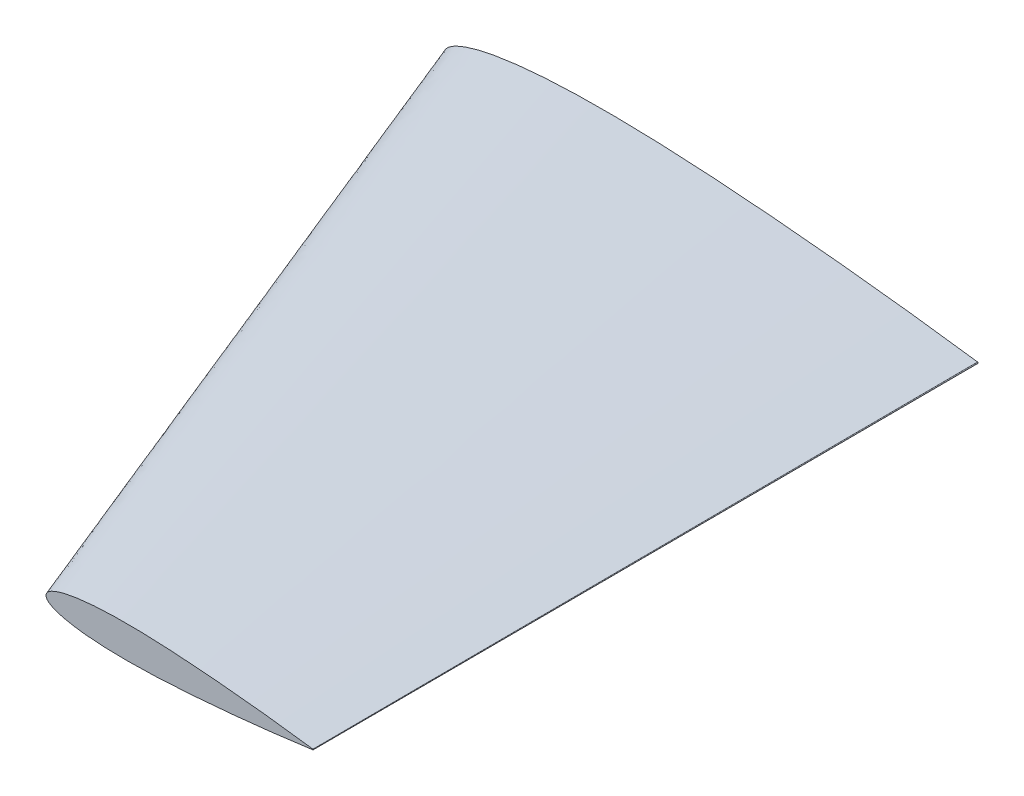
ISO-10303-21;
HEADER;
FILE_DESCRIPTION(('STEP AP214'),'2;1');
FILE_NAME('part.step','',(''),(''),'','','');
FILE_SCHEMA(('AUTOMOTIVE_DESIGN { 1 0 10303 214 1 1 1 1 }'));
ENDSEC;
DATA;
#1=APPLICATION_CONTEXT('core data for automotive mechanical design processes');
#2=APPLICATION_PROTOCOL_DEFINITION('international standard','automotive_design',2000,#1);
#3=PRODUCT_CONTEXT('',#1,'mechanical');
#4=PRODUCT('Part','Part','',(#3));
#5=PRODUCT_RELATED_PRODUCT_CATEGORY('part','',(#4));
#6=PRODUCT_DEFINITION_FORMATION('','',#4);
#7=PRODUCT_DEFINITION_CONTEXT('part definition',#1,'design');
#8=PRODUCT_DEFINITION('design','',#6,#7);
#9=PRODUCT_DEFINITION_SHAPE('','',#8);
#10=(LENGTH_UNIT() NAMED_UNIT(*) SI_UNIT(.MILLI.,.METRE.));
#11=(NAMED_UNIT(*) PLANE_ANGLE_UNIT() SI_UNIT($,.RADIAN.));
#12=(NAMED_UNIT(*) SI_UNIT($,.STERADIAN.) SOLID_ANGLE_UNIT());
#13=UNCERTAINTY_MEASURE_WITH_UNIT(LENGTH_MEASURE(1.E-05),#10,'distance_accuracy_value','');
#14=(GEOMETRIC_REPRESENTATION_CONTEXT(3) GLOBAL_UNCERTAINTY_ASSIGNED_CONTEXT((#13)) GLOBAL_UNIT_ASSIGNED_CONTEXT((#10,
#11,#12)) REPRESENTATION_CONTEXT('',''));
#15=CARTESIAN_POINT('',(0.,0.,0.));
#16=DIRECTION('',(0.,0.,1.));
#17=DIRECTION('',(1.,0.,0.));
#18=AXIS2_PLACEMENT_3D('',#15,#16,#17);
#19=CARTESIAN_POINT('',(102.616,-5.18411073244439E-10,254.));
#20=DIRECTION('',(0.,0.,-1.));
#21=DIRECTION('',(-1.,0.,0.));
#22=AXIS2_PLACEMENT_3D('',#19,#20,#21);
#23=PLANE('',#22);
#24=CARTESIAN_POINT('',(204.215999994455,0.128015999993105,254.));
#25=CARTESIAN_POINT('',(204.196221997628,0.130794040007704,254.));
#26=CARTESIAN_POINT('',(204.117181092102,0.141896215837817,254.));
#27=CARTESIAN_POINT('',(203.801726003658,0.18601561779934,254.));
#28=CARTESIAN_POINT('',(203.329498994756,0.251964648225595,254.));
#29=CARTESIAN_POINT('',(202.701473383113,0.338574378265588,254.));
#30=CARTESIAN_POINT('',(202.057057480721,0.427173868338133,254.));
#31=CARTESIAN_POINT('',(201.299005636795,0.530413304347605,254.));
#32=CARTESIAN_POINT('',(200.429114493692,0.647624015634377,254.));
#33=CARTESIAN_POINT('',(199.449444115335,0.778304783285884,254.));
#34=CARTESIAN_POINT('',(198.362271504538,0.921517393490011,254.));
#35=CARTESIAN_POINT('',(197.170129806897,1.07658913459812,254.));
#36=CARTESIAN_POINT('',(195.875778618515,1.2422752594881,254.));
#37=CARTESIAN_POINT('',(193.954826932945,1.48472650742518,254.));
#38=CARTESIAN_POINT('',(191.908110916693,1.73633896613952,254.));
#39=CARTESIAN_POINT('',(189.740366176418,1.99586146186702,254.));
#40=CARTESIAN_POINT('',(187.984943387589,2.20196749111941,254.));
#41=CARTESIAN_POINT('',(186.14872344418,2.41294174035475,254.));
#42=CARTESIAN_POINT('',(184.236099413994,2.62824541512439,254.));
#43=CARTESIAN_POINT('',(182.251478268623,2.84633402861111,254.));
#44=CARTESIAN_POINT('',(180.199558098112,3.06662184046572,254.));
#45=CARTESIAN_POINT('',(178.085050874492,3.28753463393156,254.));
#46=CARTESIAN_POINT('',(175.912940921148,3.50866302999993,254.));
#47=CARTESIAN_POINT('',(173.688274596136,3.72830188452538,254.));
#48=CARTESIAN_POINT('',(171.416282715815,3.94576136741697,254.));
#49=CARTESIAN_POINT('',(169.102241258339,4.15953112791609,254.));
#50=CARTESIAN_POINT('',(166.751548314277,4.36891226918564,254.));
#51=CARTESIAN_POINT('',(164.369708413336,4.57217387013928,254.));
#52=CARTESIAN_POINT('',(161.962272189334,4.76840676281634,254.));
#53=CARTESIAN_POINT('',(159.534892758437,4.9563577726038,254.));
#54=CARTESIAN_POINT('',(157.093208400006,5.1345181213148,254.));
#55=CARTESIAN_POINT('',(154.642957175781,5.30177040561608,254.));
#56=CARTESIAN_POINT('',(152.189858846806,5.45677864208881,254.));
#57=CARTESIAN_POINT('',(148.930348799388,5.64470171591802,254.));
#58=CARTESIAN_POINT('',(145.685518487789,5.803241590677,254.));
#59=CARTESIAN_POINT('',(141.67923241427,5.95751181025852,254.));
#60=CARTESIAN_POINT('',(138.525257458584,6.04438787632629,254.));
#61=CARTESIAN_POINT('',(135.416243016173,6.08955880203841,254.));
#62=CARTESIAN_POINT('',(133.144093408035,6.10146206085851,254.));
#63=CARTESIAN_POINT('',(130.919271078906,6.09093929316082,254.));
#64=CARTESIAN_POINT('',(128.746982949108,6.05751739133572,254.));
#65=CARTESIAN_POINT('',(126.632319385863,6.00018631270272,254.));
#66=CARTESIAN_POINT('',(124.580172139174,5.91919975869155,254.));
#67=CARTESIAN_POINT('',(122.595329625853,5.81397582217043,254.));
#68=CARTESIAN_POINT('',(120.682412811362,5.6848094302117,254.));
#69=CARTESIAN_POINT('',(118.845926182775,5.53172751594686,254.));
#70=CARTESIAN_POINT('',(117.090139460573,5.35500830728771,254.));
#71=CARTESIAN_POINT('',(115.419132273225,5.15532218289828,254.));
#72=CARTESIAN_POINT('',(113.836756945811,4.9334808112398,254.));
#73=CARTESIAN_POINT('',(112.346741177889,4.68989772373038,254.));
#74=CARTESIAN_POINT('',(110.952499804213,4.42579030986093,254.));
#75=CARTESIAN_POINT('',(109.657241648329,4.14215165202918,254.));
#76=CARTESIAN_POINT('',(108.463993834232,3.83994325730421,254.));
#77=CARTESIAN_POINT('',(107.37539306749,3.52051896926268,254.));
#78=CARTESIAN_POINT('',(106.39383971102,3.18493959466409,254.));
#79=CARTESIAN_POINT('',(105.521426980889,2.8343641503942,254.));
#80=CARTESIAN_POINT('',(104.759881858143,2.46980398069491,254.));
#81=CARTESIAN_POINT('',(104.110655185344,2.09201808215752,254.));
#82=CARTESIAN_POINT('',(103.574502960046,1.70164687585348,254.));
#83=CARTESIAN_POINT('',(103.152461173695,1.29804822333972,254.));
#84=CARTESIAN_POINT('',(102.8455475918,0.880078796584235,254.));
#85=CARTESIAN_POINT('',(102.657900143645,0.445695610322342,254.));
#86=CARTESIAN_POINT('',(102.59557611553,-5.1854680578997E-10,254.));
#87=CARTESIAN_POINT('',(102.657900143649,-0.445695611358771,254.));
#88=CARTESIAN_POINT('',(102.845547591809,-0.88007879761878,254.));
#89=CARTESIAN_POINT('',(103.152461173709,-1.29804822437112,254.));
#90=CARTESIAN_POINT('',(103.574502960063,-1.70164687688056,254.));
#91=CARTESIAN_POINT('',(104.110655185366,-2.09201808317914,254.));
#92=CARTESIAN_POINT('',(104.759881858169,-2.4698039817099,254.));
#93=CARTESIAN_POINT('',(105.521426980918,-2.83436415140142,254.));
#94=CARTESIAN_POINT('',(106.393839711053,-3.18493959566241,254.));
#95=CARTESIAN_POINT('',(107.375393067525,-3.52051897025097,254.));
#96=CARTESIAN_POINT('',(108.463993834271,-3.83994325828139,254.));
#97=CARTESIAN_POINT('',(109.657241648371,-4.14215165299418,254.));
#98=CARTESIAN_POINT('',(110.952499804258,-4.42579031081271,254.));
#99=CARTESIAN_POINT('',(112.346741177937,-4.68989772466793,254.));
#100=CARTESIAN_POINT('',(113.836756945861,-4.93348081216215,254.));
#101=CARTESIAN_POINT('',(115.419132273277,-5.15532218380449,254.));
#102=CARTESIAN_POINT('',(117.090139460628,-5.35500830817684,254.));
#103=CARTESIAN_POINT('',(118.845926182831,-5.53172751681808,254.));
#104=CARTESIAN_POINT('',(120.68241281142,-5.68480943106417,254.));
#105=CARTESIAN_POINT('',(122.595329625913,-5.81397582300336,254.));
#106=CARTESIAN_POINT('',(124.580172139235,-5.91919975950423,254.));
#107=CARTESIAN_POINT('',(126.632319385925,-6.00018631349445,254.));
#108=CARTESIAN_POINT('',(128.746982949169,-6.05751739210588,254.));
#109=CARTESIAN_POINT('',(130.919271078968,-6.09093929390881,254.));
#110=CARTESIAN_POINT('',(133.144093408097,-6.10146206158378,254.));
#111=CARTESIAN_POINT('',(135.416243016235,-6.08955880274047,254.));
#112=CARTESIAN_POINT('',(138.525257458646,-6.04438787699663,254.));
#113=CARTESIAN_POINT('',(142.489535380528,-5.9351920604099,254.));
#114=CARTESIAN_POINT('',(146.49528688636,-5.76600851346705,254.));
#115=CARTESIAN_POINT('',(149.739591565609,-5.59804581240266,254.));
#116=CARTESIAN_POINT('',(152.189858846862,-5.45677864261967,254.));
#117=CARTESIAN_POINT('',(154.642957175835,-5.30177040612189,254.));
#118=CARTESIAN_POINT('',(157.093208400059,-5.13451812179562,254.));
#119=CARTESIAN_POINT('',(159.534892758487,-4.95635777305968,254.));
#120=CARTESIAN_POINT('',(161.962272189382,-4.76840676324745,254.));
#121=CARTESIAN_POINT('',(164.369708413383,-4.57217387054581,254.));
#122=CARTESIAN_POINT('',(166.751548314322,-4.36891226956787,254.));
#123=CARTESIAN_POINT('',(169.102241258381,-4.15953112827432,254.));
#124=CARTESIAN_POINT('',(171.416282715855,-3.94576136775158,254.));
#125=CARTESIAN_POINT('',(173.688274596175,-3.7283018848368,254.));
#126=CARTESIAN_POINT('',(175.912940921184,-3.50866303028865,254.));
#127=CARTESIAN_POINT('',(178.085050874526,-3.2875346341981,254.));
#128=CARTESIAN_POINT('',(180.199558098143,-3.06662184071068,254.));
#129=CARTESIAN_POINT('',(182.251478268652,-2.84633402883512,254.));
#130=CARTESIAN_POINT('',(184.236099414021,-2.62824541532815,254.));
#131=CARTESIAN_POINT('',(186.148723444204,-2.41294174053899,254.));
#132=CARTESIAN_POINT('',(187.984943387611,-2.20196749128489,254.));
#133=CARTESIAN_POINT('',(189.740366176438,-1.99586146201459,254.));
#134=CARTESIAN_POINT('',(191.908110916711,-1.73633896626497,254.));
#135=CARTESIAN_POINT('',(193.95482693296,-1.48472650752973,254.));
#136=CARTESIAN_POINT('',(195.875778618528,-1.24227525957305,254.));
#137=CARTESIAN_POINT('',(197.170129806908,-1.07658913466986,254.));
#138=CARTESIAN_POINT('',(198.362271504548,-0.921517393549576,254.));
#139=CARTESIAN_POINT('',(199.449444115343,-0.778304783334353,254.));
#140=CARTESIAN_POINT('',(200.429114493699,-0.64762401567285,254.));
#141=CARTESIAN_POINT('',(201.299005636801,-0.530413304377185,254.));
#142=CARTESIAN_POINT('',(202.057057480726,-0.427173868359974,254.));
#143=CARTESIAN_POINT('',(202.701473383117,-0.338574378280851,254.));
#144=CARTESIAN_POINT('',(203.329498994759,-0.251964648234463,254.));
#145=CARTESIAN_POINT('',(203.80172600366,-0.186015617803373,254.));
#146=CARTESIAN_POINT('',(204.117181092103,-0.141896215838646,254.));
#147=CARTESIAN_POINT('',(204.196221997629,-0.130794040007707,254.));
#148=CARTESIAN_POINT('',(204.215999994456,-0.128015999992924,254.));
#149=B_SPLINE_CURVE_WITH_KNOTS('',3,(#24,#25,#26,#27,#28,#29,#30,#31,#32,#33,#34,#35,#36,#37,
#38,#39,#40,#41,#42,#43,#44,#45,#46,#47,#48,#49,#50,#51,#52,#53,#54,#55,#56,#57,#58,#59,#60,#61,
#62,#63,#64,#65,#66,#67,#68,#69,#70,#71,#72,#73,#74,#75,#76,#77,#78,#79,#80,#81,#82,#83,#84,#85,
#86,#87,#88,#89,#90,#91,#92,#93,#94,#95,#96,#97,#98,#99,#100,#101,#102,#103,#104,#105,#106,#107,
#108,#109,#110,#111,#112,#113,#114,#115,#116,#117,#118,#119,#120,#121,#122,#123,#124,#125,#126,
#127,#128,#129,#130,#131,#132,#133,#134,#135,#136,#137,#138,#139,#140,#141,#142,#143,#144,#145,
#146,#147,#148),.UNSPECIFIED.,.F.,.F.,(4,1,1,1,1,1,1,1,1,1,1,1,1,1,1,1,1,1,1,1,1,1,1,1,1,1,1,1,
1,1,1,1,1,1,1,1,1,1,1,1,1,1,1,1,1,1,1,1,1,1,1,1,1,1,1,1,1,1,1,1,1,1,1,1,1,1,1,1,1,1,1,1,1,1,1,1,
1,1,1,1,1,1,1,1,1,1,1,1,1,1,1,1,1,1,1,1,1,1,1,1,1,1,1,1,1,1,1,1,1,1,1,1,1,1,1,1,1,1,1,1,1,1,4),
(0.,0.000289201378228584,0.00115576612811508,0.00461232240327471,0.00719351750498146,
0.0103357928948401,0.0140313969623457,0.0182716120853123,0.0230458473649681,0.0283429008690871,
0.0341501195438393,0.0404537601194177,0.0472383298988339,0.0621866127014251,0.0703137241968131,
0.0788519079930911,0.0877801263970524,0.0970775209084771,0.106722048517726,0.116690867689892,
0.126960504753417,0.137507218023907,0.148306054540842,0.159330764906486,0.170556489755233,
0.181956531155254,0.193504043461122,0.205171366742429,0.216932300344852,0.228758168756788,
0.240621400483931,0.252494935762872,0.264350287074715,0.287897994318805,0.299535853600575,
0.322404758964058,0.333584031906799,0.344559265520828,0.35530595971865,0.365799778375851,
0.376017570419826,0.385937299648593,0.395537658905913,0.404797976198219,0.413698812078543,
0.422221441287427,0.430349273099823,0.438066019294824,0.445356904422305,0.452209372098903,
0.458611567079498,0.464554044050621,0.470029850192537,0.475034902370301,0.479569141493347,
0.483636857140142,0.487250262770083,0.490431337960153,0.493218828079602,0.495674085869199,
0.497891368316545,0.5,0.502108631683455,0.504325914130801,0.506781171920398,0.509568662039847,
0.512749737229918,0.516363142859858,0.520430858506654,0.524965097629699,0.529970149807464,
0.53544595594938,0.541388432920502,0.547790627901097,0.554643095577695,0.561933980705176,
0.569650726900178,0.577778558712573,0.586301187921457,0.595202023801781,0.604462341094087,
0.614062700351408,0.623982429580174,0.634200221624149,0.64469404028135,0.655440734479172,
0.666415968093201,0.677595241035943,0.700464146399425,0.723839426647284,0.735649712925285,
0.747505064237128,0.75937859951607,0.771241831243213,0.783067699655148,0.794828633257572,
0.806495956538878,0.818043468844746,0.829443510244768,0.840669235093514,0.851693945459158,
0.862492781976093,0.873039495246583,0.883309132310108,0.893277951482274,0.902922479091523,
0.912219873602948,0.921148092006909,0.929686275803187,0.937813387298575,0.952761670101166,
0.959546239880582,0.965849880456161,0.971657099130913,0.976954152635032,0.981728387914688,
0.985968603037655,0.98966420710516,0.992806482495019,0.995387677596725,0.998844233871885,
0.999710798621771,1.),.UNSPECIFIED.);
#150=CARTESIAN_POINT('',(204.215999994455,0.128015999993014,254.));
#151=VERTEX_POINT('',#150);
#152=CARTESIAN_POINT('',(204.215999994456,-0.128015999993014,254.));
#153=VERTEX_POINT('',#152);
#154=EDGE_CURVE('E80',#151,#153,#149,.T.);
#155=ORIENTED_EDGE('',*,*,#154,.T.);
#156=CARTESIAN_POINT('',(204.198438008063,0.,254.));
#157=DIRECTION('',(0.,0.,1.));
#158=DIRECTION('',(-1.,0.,0.));
#159=AXIS2_PLACEMENT_3D('',#156,#157,#158);
#160=CIRCLE('',#159,0.129215013137975);
#161=EDGE_CURVE('E12',#153,#151,#160,.T.);
#162=ORIENTED_EDGE('',*,*,#161,.T.);
#163=EDGE_LOOP('',(#155,#162));
#164=FACE_BOUND('',#163,.T.);
#165=ADVANCED_FACE('F69',(#164),#23,.F.);
#166=CARTESIAN_POINT('',(0.,0.,0.));
#167=DIRECTION('',(0.,0.,-1.));
#168=DIRECTION('',(-1.,0.,0.));
#169=AXIS2_PLACEMENT_3D('',#166,#167,#168);
#170=PLANE('',#169);
#171=CARTESIAN_POINT('',(203.2,0.256032,0.));
#172=CARTESIAN_POINT('',(203.160444006344,0.261588080029679,0.));
#173=CARTESIAN_POINT('',(203.002362195283,0.283792431691948,0.));
#174=CARTESIAN_POINT('',(202.371452018362,0.372031235623021,0.));
#175=CARTESIAN_POINT('',(201.426998000508,0.503929296487551,0.));
#176=CARTESIAN_POINT('',(200.170946777154,0.677148756583386,0.));
#177=CARTESIAN_POINT('',(198.882114972301,0.854347736744727,0.));
#178=CARTESIAN_POINT('',(197.366011284367,1.06082660878267,0.));
#179=CARTESIAN_POINT('',(195.626228998067,1.29524803137791,0.));
#180=CARTESIAN_POINT('',(193.666888241246,1.55660956670517,0.));
#181=CARTESIAN_POINT('',(191.492543019537,1.84303478714018,0.));
#182=CARTESIAN_POINT('',(189.108259624124,2.15317826938548,0.));
#183=CARTESIAN_POINT('',(186.519557247222,2.48455051919674,0.));
#184=CARTESIAN_POINT('',(182.677653875875,2.96945301511696,0.));
#185=CARTESIAN_POINT('',(178.584221843149,3.47267793259401,0.));
#186=CARTESIAN_POINT('',(174.248732362365,3.99172292409947,0.));
#187=CARTESIAN_POINT('',(170.737886784517,4.40393498264465,0.));
#188=CARTESIAN_POINT('',(167.065446897501,4.8258834811571,0.));
#189=CARTESIAN_POINT('',(163.240198836923,5.25649083073942,0.));
#190=CARTESIAN_POINT('',(159.270956545966,5.6926680577569,0.));
#191=CARTESIAN_POINT('',(155.167116204723,6.13324368151113,0.));
#192=CARTESIAN_POINT('',(150.938101757255,6.57506926848848,0.));
#193=CARTESIAN_POINT('',(146.593881850332,7.01732606067153,0.));
#194=CARTESIAN_POINT('',(142.144549200068,7.45660376976911,0.));
#195=CARTESIAN_POINT('',(137.60056543918,7.89152273559921,0.));
#196=CARTESIAN_POINT('',(132.972482523977,8.31906225664442,0.));
#197=CARTESIAN_POINT('',(128.2710966356,8.73782453923035,0.));
#198=CARTESIAN_POINT('',(123.507416833459,9.14434774118413,0.));
#199=CARTESIAN_POINT('',(118.692544385193,9.53681352658424,0.));
#200=CARTESIAN_POINT('',(113.837785523136,9.91271554620444,0.));
#201=CARTESIAN_POINT('',(108.954416806011,10.2690362436708,0.));
#202=CARTESIAN_POINT('',(104.053914357294,10.6035408123166,0.));
#203=CARTESIAN_POINT('',(99.1477176990792,10.9135572853041,0.));
#204=CARTESIAN_POINT('',(92.6286976038885,11.2894034330163,0.));
#205=CARTESIAN_POINT('',(86.1390369803376,11.6064831825847,0.));
#206=CARTESIAN_POINT('',(78.1264648328633,11.9150236218054,0.));
#207=CARTESIAN_POINT('',(71.8185149211498,12.0887757539826,0.));
#208=CARTESIAN_POINT('',(65.6004860359868,12.1791176054435,0.));
#209=CARTESIAN_POINT('',(61.0561868194642,12.2029241231082,0.));
#210=CARTESIAN_POINT('',(56.6065421609638,12.1818785877344,0.));
#211=CARTESIAN_POINT('',(52.2619659011289,12.1150347841028,0.));
#212=CARTESIAN_POINT('',(48.0326387744092,12.0003726268521,0.));
#213=CARTESIAN_POINT('',(43.9283442808064,11.8383995188418,0.));
#214=CARTESIAN_POINT('',(39.9586592539463,11.6279516458084,0.));
#215=CARTESIAN_POINT('',(36.1328256247543,11.3696188618963,0.));
#216=CARTESIAN_POINT('',(32.4598523673773,11.0634550333687,0.));
#217=CARTESIAN_POINT('',(28.9482789227808,10.710016616049,0.));
#218=CARTESIAN_POINT('',(25.6062645478996,10.3106443672654,0.));
#219=CARTESIAN_POINT('',(22.4415138928964,9.86696162394041,0.));
#220=CARTESIAN_POINT('',(19.4614823568881,9.37979544891021,0.));
#221=CARTESIAN_POINT('',(16.6729996093803,8.85158062115671,0.));
#222=CARTESIAN_POINT('',(14.0824832974677,8.28430330547546,0.));
#223=CARTESIAN_POINT('',(11.6959876691416,7.67988651600472,0.));
#224=CARTESIAN_POINT('',(9.51878613553431,7.0410379398979,0.));
#225=CARTESIAN_POINT('',(7.55567942248531,6.36987919067413,0.));
#226=CARTESIAN_POINT('',(5.8108539621232,5.66872830210497,0.));
#227=CARTESIAN_POINT('',(4.28776371654601,4.93960796267439,0.));
#228=CARTESIAN_POINT('',(2.98931037087336,4.184036165565,0.));
#229=CARTESIAN_POINT('',(1.91700592021396,3.40329375291977,0.));
#230=CARTESIAN_POINT('',(1.07292234746264,2.59609644785252,0.));
#231=CARTESIAN_POINT('',(0.45909518363488,1.76015759429906,0.));
#232=CARTESIAN_POINT('',(0.0838002872988007,0.891391221729771,0.));
#233=CARTESIAN_POINT('',(-0.0408477689426934,0.,0.));
#234=CARTESIAN_POINT('',(0.0838002872987965,-0.891391221729751,0.));
#235=CARTESIAN_POINT('',(0.459095183634887,-1.76015759429907,0.));
#236=CARTESIAN_POINT('',(1.07292234746263,-2.59609644785251,0.));
#237=CARTESIAN_POINT('',(1.91700592021396,-3.40329375291977,0.));
#238=CARTESIAN_POINT('',(2.98931037087336,-4.184036165565,0.));
#239=CARTESIAN_POINT('',(4.287763716546,-4.93960796267439,0.));
#240=CARTESIAN_POINT('',(5.81085396212321,-5.66872830210498,0.));
#241=CARTESIAN_POINT('',(7.55567942248531,-6.36987919067413,0.));
#242=CARTESIAN_POINT('',(9.51878613553431,-7.0410379398979,0.));
#243=CARTESIAN_POINT('',(11.6959876691416,-7.67988651600473,0.));
#244=CARTESIAN_POINT('',(14.0824832974677,-8.28430330547545,0.));
#245=CARTESIAN_POINT('',(16.6729996093803,-8.85158062115671,0.));
#246=CARTESIAN_POINT('',(19.4614823568881,-9.37979544891021,0.));
#247=CARTESIAN_POINT('',(22.4415138928964,-9.86696162394041,0.));
#248=CARTESIAN_POINT('',(25.6062645478996,-10.3106443672655,0.));
#249=CARTESIAN_POINT('',(28.9482789227808,-10.710016616049,0.));
#250=CARTESIAN_POINT('',(32.4598523673773,-11.0634550333687,0.));
#251=CARTESIAN_POINT('',(36.1328256247543,-11.3696188618963,0.));
#252=CARTESIAN_POINT('',(39.9586592539463,-11.6279516458084,0.));
#253=CARTESIAN_POINT('',(43.9283442808064,-11.8383995188418,0.));
#254=CARTESIAN_POINT('',(48.0326387744092,-12.0003726268521,0.));
#255=CARTESIAN_POINT('',(52.2619659011289,-12.1150347841028,0.));
#256=CARTESIAN_POINT('',(56.6065421609638,-12.1818785877344,0.));
#257=CARTESIAN_POINT('',(61.0561868194642,-12.2029241231082,0.));
#258=CARTESIAN_POINT('',(65.6004860359868,-12.1791176054435,0.));
#259=CARTESIAN_POINT('',(71.8185149211498,-12.0887757539826,0.));
#260=CARTESIAN_POINT('',(79.7470707653471,-11.8703841208377,0.));
#261=CARTESIAN_POINT('',(87.7585737774498,-11.5320170269744,0.));
#262=CARTESIAN_POINT('',(94.2471831363044,-11.1960916248604,0.));
#263=CARTESIAN_POINT('',(99.1477176990792,-10.9135572853041,0.));
#264=CARTESIAN_POINT('',(104.053914357294,-10.6035408123166,0.));
#265=CARTESIAN_POINT('',(108.954416806011,-10.2690362436708,0.));
#266=CARTESIAN_POINT('',(113.837785523136,-9.91271554620444,0.));
#267=CARTESIAN_POINT('',(118.692544385193,-9.53681352658424,0.));
#268=CARTESIAN_POINT('',(123.507416833459,-9.14434774118413,0.));
#269=CARTESIAN_POINT('',(128.2710966356,-8.73782453923035,0.));
#270=CARTESIAN_POINT('',(132.972482523977,-8.31906225664442,0.));
#271=CARTESIAN_POINT('',(137.600565439179,-7.89152273559921,0.));
#272=CARTESIAN_POINT('',(142.144549200068,-7.45660376976911,0.));
#273=CARTESIAN_POINT('',(146.593881850332,-7.01732606067153,0.));
#274=CARTESIAN_POINT('',(150.938101757255,-6.57506926848848,0.));
#275=CARTESIAN_POINT('',(155.167116204723,-6.13324368151113,0.));
#276=CARTESIAN_POINT('',(159.270956545966,-5.6926680577569,0.));
#277=CARTESIAN_POINT('',(163.240198836923,-5.25649083073943,0.));
#278=CARTESIAN_POINT('',(167.065446897501,-4.8258834811571,0.));
#279=CARTESIAN_POINT('',(170.737886784517,-4.40393498264464,0.));
#280=CARTESIAN_POINT('',(174.248732362365,-3.99172292409947,0.));
#281=CARTESIAN_POINT('',(178.584221843149,-3.472677932594,0.));
#282=CARTESIAN_POINT('',(182.677653875875,-2.96945301511696,0.));
#283=CARTESIAN_POINT('',(186.519557247222,-2.48455051919674,0.));
#284=CARTESIAN_POINT('',(189.108259624124,-2.15317826938548,0.));
#285=CARTESIAN_POINT('',(191.492543019537,-1.84303478714018,0.));
#286=CARTESIAN_POINT('',(193.666888241246,-1.55660956670517,0.));
#287=CARTESIAN_POINT('',(195.626228998067,-1.29524803137792,0.));
#288=CARTESIAN_POINT('',(197.366011284367,-1.06082660878267,0.));
#289=CARTESIAN_POINT('',(198.882114972301,-0.854347736744729,0.));
#290=CARTESIAN_POINT('',(200.170946777154,-0.677148756583385,0.));
#291=CARTESIAN_POINT('',(201.426998000508,-0.503929296487548,0.));
#292=CARTESIAN_POINT('',(202.371452018361,-0.372031235623019,0.));
#293=CARTESIAN_POINT('',(203.002362195283,-0.283792431691951,0.));
#294=CARTESIAN_POINT('',(203.160444006344,-0.26158808002968,0.));
#295=CARTESIAN_POINT('',(203.2,-0.256032,0.));
#296=B_SPLINE_CURVE_WITH_KNOTS('',3,(#171,#172,#173,#174,#175,#176,#177,#178,#179,#180,#181,
#182,#183,#184,#185,#186,#187,#188,#189,#190,#191,#192,#193,#194,#195,#196,#197,#198,#199,#200,
#201,#202,#203,#204,#205,#206,#207,#208,#209,#210,#211,#212,#213,#214,#215,#216,#217,#218,#219,
#220,#221,#222,#223,#224,#225,#226,#227,#228,#229,#230,#231,#232,#233,#234,#235,#236,#237,#238,
#239,#240,#241,#242,#243,#244,#245,#246,#247,#248,#249,#250,#251,#252,#253,#254,#255,#256,#257,
#258,#259,#260,#261,#262,#263,#264,#265,#266,#267,#268,#269,#270,#271,#272,#273,#274,#275,#276,
#277,#278,#279,#280,#281,#282,#283,#284,#285,#286,#287,#288,#289,#290,#291,#292,#293,#294,#295),
.UNSPECIFIED.,.F.,.F.,(4,1,1,1,1,1,1,1,1,1,1,1,1,1,1,1,1,1,1,1,1,1,1,1,1,1,1,1,1,1,1,1,1,1,1,1,
1,1,1,1,1,1,1,1,1,1,1,1,1,1,1,1,1,1,1,1,1,1,1,1,1,1,1,1,1,1,1,1,1,1,1,1,1,1,1,1,1,1,1,1,1,1,1,1,
1,1,1,1,1,1,1,1,1,1,1,1,1,1,1,1,1,1,1,1,1,1,1,1,1,1,1,1,1,1,1,1,1,1,1,1,1,1,4),(0.,
0.000289201378228584,0.00115576612811508,0.00461232240327471,0.00719351750498146,
0.0103357928948401,0.0140313969623457,0.0182716120853123,0.0230458473649681,0.0283429008690871,
0.0341501195438393,0.0404537601194177,0.0472383298988339,0.0621866127014251,0.0703137241968131,
0.0788519079930911,0.0877801263970524,0.0970775209084771,0.106722048517726,0.116690867689892,
0.126960504753417,0.137507218023907,0.148306054540842,0.159330764906486,0.170556489755233,
0.181956531155254,0.193504043461122,0.205171366742429,0.216932300344852,0.228758168756788,
0.240621400483931,0.252494935762872,0.264350287074715,0.287897994318805,0.299535853600575,
0.322404758964058,0.333584031906799,0.344559265520828,0.35530595971865,0.365799778375851,
0.376017570419826,0.385937299648593,0.395537658905913,0.404797976198219,0.413698812078543,
0.422221441287427,0.430349273099823,0.438066019294824,0.445356904422305,0.452209372098903,
0.458611567079498,0.464554044050621,0.470029850192537,0.475034902370301,0.479569141493347,
0.483636857140142,0.487250262770083,0.490431337960153,0.493218828079602,0.495674085869199,
0.497891368316545,0.5,0.502108631683455,0.504325914130801,0.506781171920398,0.509568662039847,
0.512749737229918,0.516363142859858,0.520430858506654,0.524965097629699,0.529970149807464,
0.53544595594938,0.541388432920502,0.547790627901097,0.554643095577695,0.561933980705176,
0.569650726900178,0.577778558712573,0.586301187921457,0.595202023801781,0.604462341094087,
0.614062700351408,0.623982429580174,0.634200221624149,0.64469404028135,0.655440734479172,
0.666415968093201,0.677595241035943,0.700464146399425,0.723839426647284,0.735649712925285,
0.747505064237128,0.75937859951607,0.771241831243213,0.783067699655148,0.794828633257572,
0.806495956538878,0.818043468844746,0.829443510244768,0.840669235093514,0.851693945459158,
0.862492781976093,0.873039495246583,0.883309132310108,0.893277951482274,0.902922479091523,
0.912219873602948,0.921148092006909,0.929686275803187,0.937813387298575,0.952761670101166,
0.959546239880582,0.965849880456161,0.971657099130913,0.976954152635032,0.981728387914688,
0.985968603037655,0.98966420710516,0.992806482495019,0.995387677596725,0.998844233871885,
0.999710798621771,1.),.UNSPECIFIED.);
#297=CARTESIAN_POINT('',(203.2,0.256032,0.));
#298=VERTEX_POINT('',#297);
#299=CARTESIAN_POINT('',(203.2,-0.256032,0.));
#300=VERTEX_POINT('',#299);
#301=EDGE_CURVE('E104',#298,#300,#296,.T.);
#302=ORIENTED_EDGE('',*,*,#301,.F.);
#303=CARTESIAN_POINT('',(203.116525612851,0.,0.));
#304=DIRECTION('',(0.,0.,1.));
#305=DIRECTION('',(-1.,0.,0.));
#306=AXIS2_PLACEMENT_3D('',#303,#304,#305);
#307=CIRCLE('',#306,0.269296042180275);
#308=EDGE_CURVE('E109',#300,#298,#307,.T.);
#309=ORIENTED_EDGE('',*,*,#308,.F.);
#310=EDGE_LOOP('',(#302,#309));
#311=FACE_BOUND('',#310,.T.);
#312=ADVANCED_FACE('F119',(#311),#170,.T.);
#313=CARTESIAN_POINT('',(203.2,0.256032,0.));
#314=CARTESIAN_POINT('',(204.215999994455,0.128015999993105,254.));
#315=CARTESIAN_POINT('',(203.160444006344,0.261588080029679,0.));
#316=CARTESIAN_POINT('',(204.196221997628,0.130794040007704,254.));
#317=CARTESIAN_POINT('',(203.002362195283,0.283792431691948,0.));
#318=CARTESIAN_POINT('',(204.117181092102,0.141896215837817,254.));
#319=CARTESIAN_POINT('',(202.371452018362,0.372031235623021,0.));
#320=CARTESIAN_POINT('',(203.801726003658,0.18601561779934,254.));
#321=CARTESIAN_POINT('',(201.426998000508,0.503929296487551,0.));
#322=CARTESIAN_POINT('',(203.329498994756,0.251964648225595,254.));
#323=CARTESIAN_POINT('',(200.170946777154,0.677148756583386,0.));
#324=CARTESIAN_POINT('',(202.701473383113,0.338574378265588,254.));
#325=CARTESIAN_POINT('',(198.882114972301,0.854347736744727,0.));
#326=CARTESIAN_POINT('',(202.057057480721,0.427173868338133,254.));
#327=CARTESIAN_POINT('',(197.366011284367,1.06082660878267,0.));
#328=CARTESIAN_POINT('',(201.299005636795,0.530413304347605,254.));
#329=CARTESIAN_POINT('',(195.626228998067,1.29524803137791,0.));
#330=CARTESIAN_POINT('',(200.429114493692,0.647624015634377,254.));
#331=CARTESIAN_POINT('',(193.666888241246,1.55660956670517,0.));
#332=CARTESIAN_POINT('',(199.449444115335,0.778304783285884,254.));
#333=CARTESIAN_POINT('',(191.492543019537,1.84303478714018,0.));
#334=CARTESIAN_POINT('',(198.362271504538,0.921517393490011,254.));
#335=CARTESIAN_POINT('',(189.108259624124,2.15317826938548,0.));
#336=CARTESIAN_POINT('',(197.170129806897,1.07658913459812,254.));
#337=CARTESIAN_POINT('',(186.519557247222,2.48455051919674,0.));
#338=CARTESIAN_POINT('',(195.875778618515,1.2422752594881,254.));
#339=CARTESIAN_POINT('',(182.677653875875,2.96945301511696,0.));
#340=CARTESIAN_POINT('',(193.954826932945,1.48472650742518,254.));
#341=CARTESIAN_POINT('',(178.584221843149,3.47267793259401,0.));
#342=CARTESIAN_POINT('',(191.908110916693,1.73633896613952,254.));
#343=CARTESIAN_POINT('',(174.248732362365,3.99172292409947,0.));
#344=CARTESIAN_POINT('',(189.740366176418,1.99586146186702,254.));
#345=CARTESIAN_POINT('',(170.737886784517,4.40393498264465,0.));
#346=CARTESIAN_POINT('',(187.984943387589,2.20196749111941,254.));
#347=CARTESIAN_POINT('',(167.065446897501,4.8258834811571,0.));
#348=CARTESIAN_POINT('',(186.14872344418,2.41294174035475,254.));
#349=CARTESIAN_POINT('',(163.240198836923,5.25649083073942,0.));
#350=CARTESIAN_POINT('',(184.236099413994,2.62824541512439,254.));
#351=CARTESIAN_POINT('',(159.270956545966,5.6926680577569,0.));
#352=CARTESIAN_POINT('',(182.251478268623,2.84633402861111,254.));
#353=CARTESIAN_POINT('',(155.167116204723,6.13324368151113,0.));
#354=CARTESIAN_POINT('',(180.199558098112,3.06662184046572,254.));
#355=CARTESIAN_POINT('',(150.938101757255,6.57506926848848,0.));
#356=CARTESIAN_POINT('',(178.085050874492,3.28753463393156,254.));
#357=CARTESIAN_POINT('',(146.593881850332,7.01732606067153,0.));
#358=CARTESIAN_POINT('',(175.912940921148,3.50866302999993,254.));
#359=CARTESIAN_POINT('',(142.144549200068,7.45660376976911,0.));
#360=CARTESIAN_POINT('',(173.688274596136,3.72830188452538,254.));
#361=CARTESIAN_POINT('',(137.60056543918,7.89152273559921,0.));
#362=CARTESIAN_POINT('',(171.416282715815,3.94576136741697,254.));
#363=CARTESIAN_POINT('',(132.972482523977,8.31906225664442,0.));
#364=CARTESIAN_POINT('',(169.102241258339,4.15953112791609,254.));
#365=CARTESIAN_POINT('',(128.2710966356,8.73782453923035,0.));
#366=CARTESIAN_POINT('',(166.751548314277,4.36891226918564,254.));
#367=CARTESIAN_POINT('',(123.507416833459,9.14434774118413,0.));
#368=CARTESIAN_POINT('',(164.369708413336,4.57217387013928,254.));
#369=CARTESIAN_POINT('',(118.692544385193,9.53681352658424,0.));
#370=CARTESIAN_POINT('',(161.962272189334,4.76840676281634,254.));
#371=CARTESIAN_POINT('',(113.837785523136,9.91271554620444,0.));
#372=CARTESIAN_POINT('',(159.534892758437,4.9563577726038,254.));
#373=CARTESIAN_POINT('',(108.954416806011,10.2690362436708,0.));
#374=CARTESIAN_POINT('',(157.093208400006,5.1345181213148,254.));
#375=CARTESIAN_POINT('',(104.053914357294,10.6035408123166,0.));
#376=CARTESIAN_POINT('',(154.642957175781,5.30177040561608,254.));
#377=CARTESIAN_POINT('',(99.1477176990792,10.9135572853041,0.));
#378=CARTESIAN_POINT('',(152.189858846806,5.45677864208881,254.));
#379=CARTESIAN_POINT('',(92.6286976038885,11.2894034330163,0.));
#380=CARTESIAN_POINT('',(148.930348799388,5.64470171591802,254.));
#381=CARTESIAN_POINT('',(86.1390369803376,11.6064831825847,0.));
#382=CARTESIAN_POINT('',(145.685518487789,5.803241590677,254.));
#383=CARTESIAN_POINT('',(78.1264648328633,11.9150236218054,0.));
#384=CARTESIAN_POINT('',(141.67923241427,5.95751181025852,254.));
#385=CARTESIAN_POINT('',(71.8185149211498,12.0887757539826,0.));
#386=CARTESIAN_POINT('',(138.525257458584,6.04438787632629,254.));
#387=CARTESIAN_POINT('',(65.6004860359868,12.1791176054435,0.));
#388=CARTESIAN_POINT('',(135.416243016173,6.08955880203841,254.));
#389=CARTESIAN_POINT('',(61.0561868194642,12.2029241231082,0.));
#390=CARTESIAN_POINT('',(133.144093408035,6.10146206085851,254.));
#391=CARTESIAN_POINT('',(56.6065421609638,12.1818785877344,0.));
#392=CARTESIAN_POINT('',(130.919271078906,6.09093929316082,254.));
#393=CARTESIAN_POINT('',(52.2619659011289,12.1150347841028,0.));
#394=CARTESIAN_POINT('',(128.746982949108,6.05751739133572,254.));
#395=CARTESIAN_POINT('',(48.0326387744092,12.0003726268521,0.));
#396=CARTESIAN_POINT('',(126.632319385863,6.00018631270272,254.));
#397=CARTESIAN_POINT('',(43.9283442808064,11.8383995188418,0.));
#398=CARTESIAN_POINT('',(124.580172139174,5.91919975869155,254.));
#399=CARTESIAN_POINT('',(39.9586592539463,11.6279516458084,0.));
#400=CARTESIAN_POINT('',(122.595329625853,5.81397582217043,254.));
#401=CARTESIAN_POINT('',(36.1328256247543,11.3696188618963,0.));
#402=CARTESIAN_POINT('',(120.682412811362,5.6848094302117,254.));
#403=CARTESIAN_POINT('',(32.4598523673773,11.0634550333687,0.));
#404=CARTESIAN_POINT('',(118.845926182775,5.53172751594686,254.));
#405=CARTESIAN_POINT('',(28.9482789227808,10.710016616049,0.));
#406=CARTESIAN_POINT('',(117.090139460573,5.35500830728771,254.));
#407=CARTESIAN_POINT('',(25.6062645478996,10.3106443672654,0.));
#408=CARTESIAN_POINT('',(115.419132273225,5.15532218289828,254.));
#409=CARTESIAN_POINT('',(22.4415138928964,9.86696162394041,0.));
#410=CARTESIAN_POINT('',(113.836756945811,4.9334808112398,254.));
#411=CARTESIAN_POINT('',(19.4614823568881,9.37979544891021,0.));
#412=CARTESIAN_POINT('',(112.346741177889,4.68989772373038,254.));
#413=CARTESIAN_POINT('',(16.6729996093803,8.85158062115671,0.));
#414=CARTESIAN_POINT('',(110.952499804213,4.42579030986093,254.));
#415=CARTESIAN_POINT('',(14.0824832974677,8.28430330547546,0.));
#416=CARTESIAN_POINT('',(109.657241648329,4.14215165202918,254.));
#417=CARTESIAN_POINT('',(11.6959876691416,7.67988651600472,0.));
#418=CARTESIAN_POINT('',(108.463993834232,3.83994325730421,254.));
#419=CARTESIAN_POINT('',(9.51878613553431,7.0410379398979,0.));
#420=CARTESIAN_POINT('',(107.37539306749,3.52051896926268,254.));
#421=CARTESIAN_POINT('',(7.55567942248531,6.36987919067413,0.));
#422=CARTESIAN_POINT('',(106.39383971102,3.18493959466409,254.));
#423=CARTESIAN_POINT('',(5.8108539621232,5.66872830210497,0.));
#424=CARTESIAN_POINT('',(105.521426980889,2.8343641503942,254.));
#425=CARTESIAN_POINT('',(4.28776371654601,4.93960796267439,0.));
#426=CARTESIAN_POINT('',(104.759881858143,2.46980398069491,254.));
#427=CARTESIAN_POINT('',(2.98931037087336,4.184036165565,0.));
#428=CARTESIAN_POINT('',(104.110655185344,2.09201808215752,254.));
#429=CARTESIAN_POINT('',(1.91700592021396,3.40329375291977,0.));
#430=CARTESIAN_POINT('',(103.574502960046,1.70164687585348,254.));
#431=CARTESIAN_POINT('',(1.07292234746264,2.59609644785252,0.));
#432=CARTESIAN_POINT('',(103.152461173695,1.29804822333972,254.));
#433=CARTESIAN_POINT('',(0.45909518363488,1.76015759429906,0.));
#434=CARTESIAN_POINT('',(102.8455475918,0.880078796584235,254.));
#435=CARTESIAN_POINT('',(0.0838002872988007,0.891391221729771,0.));
#436=CARTESIAN_POINT('',(102.657900143645,0.445695610322342,254.));
#437=CARTESIAN_POINT('',(-0.0408477689426934,0.,0.));
#438=CARTESIAN_POINT('',(102.59557611553,-5.1854680578997E-10,254.));
#439=CARTESIAN_POINT('',(0.0838002872987965,-0.891391221729751,0.));
#440=CARTESIAN_POINT('',(102.657900143649,-0.445695611358771,254.));
#441=CARTESIAN_POINT('',(0.459095183634887,-1.76015759429907,0.));
#442=CARTESIAN_POINT('',(102.845547591809,-0.88007879761878,254.));
#443=CARTESIAN_POINT('',(1.07292234746263,-2.59609644785251,0.));
#444=CARTESIAN_POINT('',(103.152461173709,-1.29804822437112,254.));
#445=CARTESIAN_POINT('',(1.91700592021396,-3.40329375291977,0.));
#446=CARTESIAN_POINT('',(103.574502960063,-1.70164687688056,254.));
#447=CARTESIAN_POINT('',(2.98931037087336,-4.184036165565,0.));
#448=CARTESIAN_POINT('',(104.110655185366,-2.09201808317914,254.));
#449=CARTESIAN_POINT('',(4.287763716546,-4.93960796267439,0.));
#450=CARTESIAN_POINT('',(104.759881858169,-2.4698039817099,254.));
#451=CARTESIAN_POINT('',(5.81085396212321,-5.66872830210498,0.));
#452=CARTESIAN_POINT('',(105.521426980918,-2.83436415140142,254.));
#453=CARTESIAN_POINT('',(7.55567942248531,-6.36987919067413,0.));
#454=CARTESIAN_POINT('',(106.393839711053,-3.18493959566241,254.));
#455=CARTESIAN_POINT('',(9.51878613553431,-7.0410379398979,0.));
#456=CARTESIAN_POINT('',(107.375393067525,-3.52051897025097,254.));
#457=CARTESIAN_POINT('',(11.6959876691416,-7.67988651600473,0.));
#458=CARTESIAN_POINT('',(108.463993834271,-3.83994325828139,254.));
#459=CARTESIAN_POINT('',(14.0824832974677,-8.28430330547545,0.));
#460=CARTESIAN_POINT('',(109.657241648371,-4.14215165299418,254.));
#461=CARTESIAN_POINT('',(16.6729996093803,-8.85158062115671,0.));
#462=CARTESIAN_POINT('',(110.952499804258,-4.42579031081271,254.));
#463=CARTESIAN_POINT('',(19.4614823568881,-9.37979544891021,0.));
#464=CARTESIAN_POINT('',(112.346741177937,-4.68989772466793,254.));
#465=CARTESIAN_POINT('',(22.4415138928964,-9.86696162394041,0.));
#466=CARTESIAN_POINT('',(113.836756945861,-4.93348081216215,254.));
#467=CARTESIAN_POINT('',(25.6062645478996,-10.3106443672655,0.));
#468=CARTESIAN_POINT('',(115.419132273277,-5.15532218380449,254.));
#469=CARTESIAN_POINT('',(28.9482789227808,-10.710016616049,0.));
#470=CARTESIAN_POINT('',(117.090139460628,-5.35500830817684,254.));
#471=CARTESIAN_POINT('',(32.4598523673773,-11.0634550333687,0.));
#472=CARTESIAN_POINT('',(118.845926182831,-5.53172751681808,254.));
#473=CARTESIAN_POINT('',(36.1328256247543,-11.3696188618963,0.));
#474=CARTESIAN_POINT('',(120.68241281142,-5.68480943106417,254.));
#475=CARTESIAN_POINT('',(39.9586592539463,-11.6279516458084,0.));
#476=CARTESIAN_POINT('',(122.595329625913,-5.81397582300336,254.));
#477=CARTESIAN_POINT('',(43.9283442808064,-11.8383995188418,0.));
#478=CARTESIAN_POINT('',(124.580172139235,-5.91919975950423,254.));
#479=CARTESIAN_POINT('',(48.0326387744092,-12.0003726268521,0.));
#480=CARTESIAN_POINT('',(126.632319385925,-6.00018631349445,254.));
#481=CARTESIAN_POINT('',(52.2619659011289,-12.1150347841028,0.));
#482=CARTESIAN_POINT('',(128.746982949169,-6.05751739210588,254.));
#483=CARTESIAN_POINT('',(56.6065421609638,-12.1818785877344,0.));
#484=CARTESIAN_POINT('',(130.919271078968,-6.09093929390881,254.));
#485=CARTESIAN_POINT('',(61.0561868194642,-12.2029241231082,0.));
#486=CARTESIAN_POINT('',(133.144093408097,-6.10146206158378,254.));
#487=CARTESIAN_POINT('',(65.6004860359868,-12.1791176054435,0.));
#488=CARTESIAN_POINT('',(135.416243016235,-6.08955880274047,254.));
#489=CARTESIAN_POINT('',(71.8185149211498,-12.0887757539826,0.));
#490=CARTESIAN_POINT('',(138.525257458646,-6.04438787699663,254.));
#491=CARTESIAN_POINT('',(79.7470707653471,-11.8703841208377,0.));
#492=CARTESIAN_POINT('',(142.489535380528,-5.9351920604099,254.));
#493=CARTESIAN_POINT('',(87.7585737774498,-11.5320170269744,0.));
#494=CARTESIAN_POINT('',(146.49528688636,-5.76600851346705,254.));
#495=CARTESIAN_POINT('',(94.2471831363044,-11.1960916248604,0.));
#496=CARTESIAN_POINT('',(149.739591565609,-5.59804581240266,254.));
#497=CARTESIAN_POINT('',(99.1477176990792,-10.9135572853041,0.));
#498=CARTESIAN_POINT('',(152.189858846862,-5.45677864261967,254.));
#499=CARTESIAN_POINT('',(104.053914357294,-10.6035408123166,0.));
#500=CARTESIAN_POINT('',(154.642957175835,-5.30177040612189,254.));
#501=CARTESIAN_POINT('',(108.954416806011,-10.2690362436708,0.));
#502=CARTESIAN_POINT('',(157.093208400059,-5.13451812179562,254.));
#503=CARTESIAN_POINT('',(113.837785523136,-9.91271554620444,0.));
#504=CARTESIAN_POINT('',(159.534892758487,-4.95635777305968,254.));
#505=CARTESIAN_POINT('',(118.692544385193,-9.53681352658424,0.));
#506=CARTESIAN_POINT('',(161.962272189382,-4.76840676324745,254.));
#507=CARTESIAN_POINT('',(123.507416833459,-9.14434774118413,0.));
#508=CARTESIAN_POINT('',(164.369708413383,-4.57217387054581,254.));
#509=CARTESIAN_POINT('',(128.2710966356,-8.73782453923035,0.));
#510=CARTESIAN_POINT('',(166.751548314322,-4.36891226956787,254.));
#511=CARTESIAN_POINT('',(132.972482523977,-8.31906225664442,0.));
#512=CARTESIAN_POINT('',(169.102241258381,-4.15953112827432,254.));
#513=CARTESIAN_POINT('',(137.600565439179,-7.89152273559921,0.));
#514=CARTESIAN_POINT('',(171.416282715855,-3.94576136775158,254.));
#515=CARTESIAN_POINT('',(142.144549200068,-7.45660376976911,0.));
#516=CARTESIAN_POINT('',(173.688274596175,-3.7283018848368,254.));
#517=CARTESIAN_POINT('',(146.593881850332,-7.01732606067153,0.));
#518=CARTESIAN_POINT('',(175.912940921184,-3.50866303028865,254.));
#519=CARTESIAN_POINT('',(150.938101757255,-6.57506926848848,0.));
#520=CARTESIAN_POINT('',(178.085050874526,-3.2875346341981,254.));
#521=CARTESIAN_POINT('',(155.167116204723,-6.13324368151113,0.));
#522=CARTESIAN_POINT('',(180.199558098143,-3.06662184071068,254.));
#523=CARTESIAN_POINT('',(159.270956545966,-5.6926680577569,0.));
#524=CARTESIAN_POINT('',(182.251478268652,-2.84633402883512,254.));
#525=CARTESIAN_POINT('',(163.240198836923,-5.25649083073943,0.));
#526=CARTESIAN_POINT('',(184.236099414021,-2.62824541532815,254.));
#527=CARTESIAN_POINT('',(167.065446897501,-4.8258834811571,0.));
#528=CARTESIAN_POINT('',(186.148723444204,-2.41294174053899,254.));
#529=CARTESIAN_POINT('',(170.737886784517,-4.40393498264464,0.));
#530=CARTESIAN_POINT('',(187.984943387611,-2.20196749128489,254.));
#531=CARTESIAN_POINT('',(174.248732362365,-3.99172292409947,0.));
#532=CARTESIAN_POINT('',(189.740366176438,-1.99586146201459,254.));
#533=CARTESIAN_POINT('',(178.584221843149,-3.472677932594,0.));
#534=CARTESIAN_POINT('',(191.908110916711,-1.73633896626497,254.));
#535=CARTESIAN_POINT('',(182.677653875875,-2.96945301511696,0.));
#536=CARTESIAN_POINT('',(193.95482693296,-1.48472650752973,254.));
#537=CARTESIAN_POINT('',(186.519557247222,-2.48455051919674,0.));
#538=CARTESIAN_POINT('',(195.875778618528,-1.24227525957305,254.));
#539=CARTESIAN_POINT('',(189.108259624124,-2.15317826938548,0.));
#540=CARTESIAN_POINT('',(197.170129806908,-1.07658913466986,254.));
#541=CARTESIAN_POINT('',(191.492543019537,-1.84303478714018,0.));
#542=CARTESIAN_POINT('',(198.362271504548,-0.921517393549576,254.));
#543=CARTESIAN_POINT('',(193.666888241246,-1.55660956670517,0.));
#544=CARTESIAN_POINT('',(199.449444115343,-0.778304783334353,254.));
#545=CARTESIAN_POINT('',(195.626228998067,-1.29524803137792,0.));
#546=CARTESIAN_POINT('',(200.429114493699,-0.64762401567285,254.));
#547=CARTESIAN_POINT('',(197.366011284367,-1.06082660878267,0.));
#548=CARTESIAN_POINT('',(201.299005636801,-0.530413304377185,254.));
#549=CARTESIAN_POINT('',(198.882114972301,-0.854347736744729,0.));
#550=CARTESIAN_POINT('',(202.057057480726,-0.427173868359974,254.));
#551=CARTESIAN_POINT('',(200.170946777154,-0.677148756583385,0.));
#552=CARTESIAN_POINT('',(202.701473383117,-0.338574378280851,254.));
#553=CARTESIAN_POINT('',(201.426998000508,-0.503929296487548,0.));
#554=CARTESIAN_POINT('',(203.329498994759,-0.251964648234463,254.));
#555=CARTESIAN_POINT('',(202.371452018361,-0.372031235623019,0.));
#556=CARTESIAN_POINT('',(203.80172600366,-0.186015617803373,254.));
#557=CARTESIAN_POINT('',(203.002362195283,-0.283792431691951,0.));
#558=CARTESIAN_POINT('',(204.117181092103,-0.141896215838646,254.));
#559=CARTESIAN_POINT('',(203.160444006344,-0.26158808002968,0.));
#560=CARTESIAN_POINT('',(204.196221997629,-0.130794040007707,254.));
#561=CARTESIAN_POINT('',(203.2,-0.256032,0.));
#562=CARTESIAN_POINT('',(204.215999994456,-0.128015999992924,254.));
#563=B_SPLINE_SURFACE_WITH_KNOTS('',3,1,((#313,#314),(#315,#316),(#317,#318),(#319,#320),(#321,
#322),(#323,#324),(#325,#326),(#327,#328),(#329,#330),(#331,#332),(#333,#334),(#335,#336),(#337,
#338),(#339,#340),(#341,#342),(#343,#344),(#345,#346),(#347,#348),(#349,#350),(#351,#352),(#353,
#354),(#355,#356),(#357,#358),(#359,#360),(#361,#362),(#363,#364),(#365,#366),(#367,#368),(#369,
#370),(#371,#372),(#373,#374),(#375,#376),(#377,#378),(#379,#380),(#381,#382),(#383,#384),(#385,
#386),(#387,#388),(#389,#390),(#391,#392),(#393,#394),(#395,#396),(#397,#398),(#399,#400),(#401,
#402),(#403,#404),(#405,#406),(#407,#408),(#409,#410),(#411,#412),(#413,#414),(#415,#416),(#417,
#418),(#419,#420),(#421,#422),(#423,#424),(#425,#426),(#427,#428),(#429,#430),(#431,#432),(#433,
#434),(#435,#436),(#437,#438),(#439,#440),(#441,#442),(#443,#444),(#445,#446),(#447,#448),(#449,
#450),(#451,#452),(#453,#454),(#455,#456),(#457,#458),(#459,#460),(#461,#462),(#463,#464),(#465,
#466),(#467,#468),(#469,#470),(#471,#472),(#473,#474),(#475,#476),(#477,#478),(#479,#480),(#481,
#482),(#483,#484),(#485,#486),(#487,#488),(#489,#490),(#491,#492),(#493,#494),(#495,#496),(#497,
#498),(#499,#500),(#501,#502),(#503,#504),(#505,#506),(#507,#508),(#509,#510),(#511,#512),(#513,
#514),(#515,#516),(#517,#518),(#519,#520),(#521,#522),(#523,#524),(#525,#526),(#527,#528),(#529,
#530),(#531,#532),(#533,#534),(#535,#536),(#537,#538),(#539,#540),(#541,#542),(#543,#544),(#545,
#546),(#547,#548),(#549,#550),(#551,#552),(#553,#554),(#555,#556),(#557,#558),(#559,#560),(#561,
#562)),.UNSPECIFIED.,.F.,.F.,.F.,(4,1,1,1,1,1,1,1,1,1,1,1,1,1,1,1,1,1,1,1,1,1,1,1,1,1,1,1,1,1,1,
1,1,1,1,1,1,1,1,1,1,1,1,1,1,1,1,1,1,1,1,1,1,1,1,1,1,1,1,1,1,1,1,1,1,1,1,1,1,1,1,1,1,1,1,1,1,1,1,
1,1,1,1,1,1,1,1,1,1,1,1,1,1,1,1,1,1,1,1,1,1,1,1,1,1,1,1,1,1,1,1,1,1,1,1,1,1,1,1,1,1,1,4),(2,2),
(0.,0.000289201378228584,0.00115576612811508,0.00461232240327471,0.00719351750498146,
0.0103357928948401,0.0140313969623457,0.0182716120853123,0.0230458473649681,0.0283429008690871,
0.0341501195438393,0.0404537601194177,0.0472383298988339,0.0621866127014251,0.0703137241968131,
0.0788519079930911,0.0877801263970524,0.0970775209084771,0.106722048517726,0.116690867689892,
0.126960504753417,0.137507218023907,0.148306054540842,0.159330764906486,0.170556489755233,
0.181956531155254,0.193504043461122,0.205171366742429,0.216932300344852,0.228758168756788,
0.240621400483931,0.252494935762872,0.264350287074715,0.287897994318805,0.299535853600575,
0.322404758964058,0.333584031906799,0.344559265520828,0.35530595971865,0.365799778375851,
0.376017570419826,0.385937299648593,0.395537658905913,0.404797976198219,0.413698812078543,
0.422221441287427,0.430349273099823,0.438066019294824,0.445356904422305,0.452209372098903,
0.458611567079498,0.464554044050621,0.470029850192537,0.475034902370301,0.479569141493347,
0.483636857140142,0.487250262770083,0.490431337960153,0.493218828079602,0.495674085869199,
0.497891368316545,0.5,0.502108631683455,0.504325914130801,0.506781171920398,0.509568662039847,
0.512749737229918,0.516363142859858,0.520430858506654,0.524965097629699,0.529970149807464,
0.53544595594938,0.541388432920502,0.547790627901097,0.554643095577695,0.561933980705176,
0.569650726900178,0.577778558712573,0.586301187921457,0.595202023801781,0.604462341094087,
0.614062700351408,0.623982429580174,0.634200221624149,0.64469404028135,0.655440734479172,
0.666415968093201,0.677595241035943,0.700464146399425,0.723839426647284,0.735649712925285,
0.747505064237128,0.75937859951607,0.771241831243213,0.783067699655148,0.794828633257572,
0.806495956538878,0.818043468844746,0.829443510244768,0.840669235093514,0.851693945459158,
0.862492781976093,0.873039495246583,0.883309132310108,0.893277951482274,0.902922479091523,
0.912219873602948,0.921148092006909,0.929686275803187,0.937813387298575,0.952761670101166,
0.959546239880582,0.965849880456161,0.971657099130913,0.976954152635032,0.981728387914688,
0.985968603037655,0.98966420710516,0.992806482495019,0.995387677596725,0.998844233871885,
0.999710798621771,1.),(0.,1.),.UNSPECIFIED.);
#564=DIRECTION('',(0.00399996747053829,0.000503995904065803,0.999991873091158));
#565=VECTOR('',#564,1.);
#566=CARTESIAN_POINT('',(203.707999997228,-0.192023999996462,127.));
#567=LINE('',#566,#565);
#568=EDGE_CURVE('E88',#300,#153,#567,.T.);
#569=DIRECTION('',(-0.00399996747053337,0.000503995904065091,-0.999991873091158));
#570=VECTOR('',#569,1.);
#571=CARTESIAN_POINT('',(203.707999997227,0.192023999996552,127.));
#572=LINE('',#571,#570);
#573=EDGE_CURVE('E100',#151,#298,#572,.T.);
#574=ORIENTED_EDGE('',*,*,#301,.T.);
#575=ORIENTED_EDGE('',*,*,#568,.T.);
#576=ORIENTED_EDGE('',*,*,#154,.F.);
#577=ORIENTED_EDGE('',*,*,#573,.T.);
#578=EDGE_LOOP('',(#574,#575,#576,#577));
#579=FACE_BOUND('',#578,.T.);
#580=ADVANCED_FACE('F102',(#579),#563,.T.);
#581=CARTESIAN_POINT('',(203.2,-0.256032,0.));
#582=CARTESIAN_POINT('',(204.215999994456,-0.128015999993014,254.));
#583=CARTESIAN_POINT('',(203.240570211933,-0.24280485035607,0.));
#584=CARTESIAN_POINT('',(204.237138013246,-0.125116162485326,254.));
#585=CARTESIAN_POINT('',(203.286229214338,-0.216875930146268,0.));
#586=CARTESIAN_POINT('',(204.263228840908,-0.116167688875389,254.));
#587=CARTESIAN_POINT('',(203.360068912996,-0.128534596077683,0.));
#588=CARTESIAN_POINT('',(204.309489611149,-0.0732142432274126,254.));
#589=CARTESIAN_POINT('',(203.385821655031,-0.0651494556034961,0.));
#590=CARTESIAN_POINT('',(204.327653021201,-0.0375662607758623,254.));
#591=CARTESIAN_POINT('',(203.385821655031,0.065149455603476,0.));
#592=CARTESIAN_POINT('',(204.327653021201,0.0375662607769274,254.));
#593=CARTESIAN_POINT('',(203.360068912996,0.128534596077666,0.));
#594=CARTESIAN_POINT('',(204.309489611149,0.0732142432283044,254.));
#595=CARTESIAN_POINT('',(203.286229214338,0.216875930146259,0.));
#596=CARTESIAN_POINT('',(204.263228840907,0.116167688875839,254.));
#597=CARTESIAN_POINT('',(203.240570211933,0.242804850356065,0.));
#598=CARTESIAN_POINT('',(204.237138013245,0.125116162485527,254.));
#599=CARTESIAN_POINT('',(203.2,0.256032,0.));
#600=CARTESIAN_POINT('',(204.215999994455,0.128015999993014,254.));
#601=B_SPLINE_SURFACE_WITH_KNOTS('',3,1,((#581,#582),(#583,#584),(#585,#586),(#587,#588),(#589,
#590),(#591,#592),(#593,#594),(#595,#596),(#597,#598),(#599,#600)),.UNSPECIFIED.,.F.,.F.,.F.,(4,
2,2,2,4),(2,2),(0.,0.25,0.5,0.75,1.),(0.,1.),.UNSPECIFIED.);
#602=ORIENTED_EDGE('',*,*,#308,.T.);
#603=ORIENTED_EDGE('',*,*,#573,.F.);
#604=ORIENTED_EDGE('',*,*,#161,.F.);
#605=ORIENTED_EDGE('',*,*,#568,.F.);
#606=EDGE_LOOP('',(#602,#603,#604,#605));
#607=FACE_BOUND('',#606,.T.);
#608=ADVANCED_FACE('F112',(#607),#601,.T.);
#609=CLOSED_SHELL('',(#165,#312,#580,#608));
#610=MANIFOLD_SOLID_BREP('B2',#609);
#611=ADVANCED_BREP_SHAPE_REPRESENTATION('',(#18,#610),#14);
#612=SHAPE_DEFINITION_REPRESENTATION(#9,#611);
ENDSEC;
END-ISO-10303-21;
